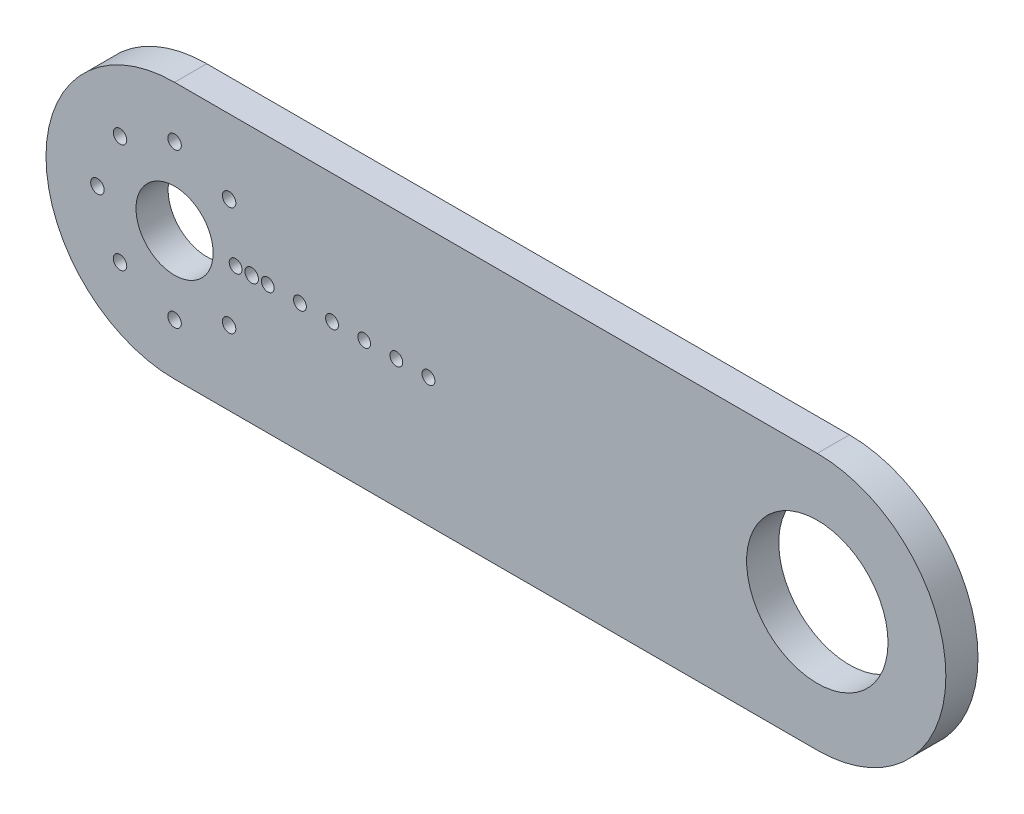
ISO-10303-21;
HEADER;
FILE_DESCRIPTION(('STEP AP214'),'2;1');
FILE_NAME('part.step','',(''),(''),'','','');
FILE_SCHEMA(('AUTOMOTIVE_DESIGN { 1 0 10303 214 1 1 1 1 }'));
ENDSEC;
DATA;
#1=APPLICATION_CONTEXT('core data for automotive mechanical design processes');
#2=APPLICATION_PROTOCOL_DEFINITION('international standard','automotive_design',2000,#1);
#3=PRODUCT_CONTEXT('',#1,'mechanical');
#4=PRODUCT('Part','Part','',(#3));
#5=PRODUCT_RELATED_PRODUCT_CATEGORY('part','',(#4));
#6=PRODUCT_DEFINITION_FORMATION('','',#4);
#7=PRODUCT_DEFINITION_CONTEXT('part definition',#1,'design');
#8=PRODUCT_DEFINITION('design','',#6,#7);
#9=PRODUCT_DEFINITION_SHAPE('','',#8);
#10=(LENGTH_UNIT() NAMED_UNIT(*) SI_UNIT(.MILLI.,.METRE.));
#11=(NAMED_UNIT(*) PLANE_ANGLE_UNIT() SI_UNIT($,.RADIAN.));
#12=(NAMED_UNIT(*) SI_UNIT($,.STERADIAN.) SOLID_ANGLE_UNIT());
#13=UNCERTAINTY_MEASURE_WITH_UNIT(LENGTH_MEASURE(1.E-05),#10,'distance_accuracy_value','');
#14=(GEOMETRIC_REPRESENTATION_CONTEXT(3) GLOBAL_UNCERTAINTY_ASSIGNED_CONTEXT((#13)) GLOBAL_UNIT_ASSIGNED_CONTEXT((#10,
#11,#12)) REPRESENTATION_CONTEXT('',''));
#15=CARTESIAN_POINT('',(0.,0.,0.));
#16=DIRECTION('',(0.,0.,1.));
#17=DIRECTION('',(1.,0.,0.));
#18=AXIS2_PLACEMENT_3D('',#15,#16,#17);
#19=CARTESIAN_POINT('',(0.,0.,2.5));
#20=DIRECTION('',(0.,0.,1.));
#21=DIRECTION('',(1.,0.,0.));
#22=AXIS2_PLACEMENT_3D('',#19,#20,#21);
#23=PLANE('',#22);
#24=CARTESIAN_POINT('',(-12.,1.25693328198353E-13,2.5));
#25=DIRECTION('',(0.,0.,1.));
#26=DIRECTION('',(1.,0.,0.));
#27=AXIS2_PLACEMENT_3D('',#24,#25,#26);
#28=CIRCLE('',#27,1.05);
#29=CARTESIAN_POINT('',(-10.95,1.25693328198353E-13,2.5));
#30=VERTEX_POINT('',#29);
#31=EDGE_CURVE('E252',#30,#30,#28,.T.);
#32=ORIENTED_EDGE('',*,*,#31,.F.);
#33=EDGE_LOOP('',(#32));
#34=FACE_BOUND('',#33,.T.);
#35=CARTESIAN_POINT('',(0.,-12.,2.5));
#36=DIRECTION('',(0.,0.,1.));
#37=DIRECTION('',(1.,0.,0.));
#38=AXIS2_PLACEMENT_3D('',#35,#36,#37);
#39=CIRCLE('',#38,1.05);
#40=CARTESIAN_POINT('',(1.04999999999992,-12.,2.5));
#41=VERTEX_POINT('',#40);
#42=EDGE_CURVE('E236',#41,#41,#39,.T.);
#43=ORIENTED_EDGE('',*,*,#42,.F.);
#44=EDGE_LOOP('',(#43));
#45=FACE_BOUND('',#44,.T.);
#46=CARTESIAN_POINT('',(12.,0.,2.5));
#47=DIRECTION('',(0.,0.,1.));
#48=DIRECTION('',(1.,0.,0.));
#49=AXIS2_PLACEMENT_3D('',#46,#47,#48);
#50=CIRCLE('',#49,1.05);
#51=CARTESIAN_POINT('',(13.05,0.,2.5));
#52=VERTEX_POINT('',#51);
#53=EDGE_CURVE('E220',#52,#52,#50,.T.);
#54=ORIENTED_EDGE('',*,*,#53,.F.);
#55=EDGE_LOOP('',(#54));
#56=FACE_BOUND('',#55,.T.);
#57=CARTESIAN_POINT('',(0.,12.,2.5));
#58=DIRECTION('',(0.,0.,1.));
#59=DIRECTION('',(1.,0.,0.));
#60=AXIS2_PLACEMENT_3D('',#57,#58,#59);
#61=CIRCLE('',#60,1.05);
#62=CARTESIAN_POINT('',(1.05,12.,2.5));
#63=VERTEX_POINT('',#62);
#64=EDGE_CURVE('E204',#63,#63,#61,.T.);
#65=ORIENTED_EDGE('',*,*,#64,.F.);
#66=EDGE_LOOP('',(#65));
#67=FACE_BOUND('',#66,.T.);
#68=CARTESIAN_POINT('',(34.5,0.,2.5));
#69=DIRECTION('',(0.,0.,1.));
#70=DIRECTION('',(1.,0.,0.));
#71=AXIS2_PLACEMENT_3D('',#68,#69,#70);
#72=CIRCLE('',#71,0.999999999999998);
#73=CARTESIAN_POINT('',(35.5,0.,2.5));
#74=VERTEX_POINT('',#73);
#75=EDGE_CURVE('E188',#74,#74,#72,.T.);
#76=ORIENTED_EDGE('',*,*,#75,.F.);
#77=EDGE_LOOP('',(#76));
#78=FACE_BOUND('',#77,.T.);
#79=CARTESIAN_POINT('',(24.5,0.,2.5));
#80=DIRECTION('',(0.,0.,1.));
#81=DIRECTION('',(1.,0.,0.));
#82=AXIS2_PLACEMENT_3D('',#79,#80,#81);
#83=CIRCLE('',#82,0.999999999999998);
#84=CARTESIAN_POINT('',(25.5,0.,2.5));
#85=VERTEX_POINT('',#84);
#86=EDGE_CURVE('E172',#85,#85,#83,.T.);
#87=ORIENTED_EDGE('',*,*,#86,.F.);
#88=EDGE_LOOP('',(#87));
#89=FACE_BOUND('',#88,.T.);
#90=CARTESIAN_POINT('',(100.,0.,2.5));
#91=DIRECTION('',(0.,0.,1.));
#92=DIRECTION('',(1.,0.,0.));
#93=AXIS2_PLACEMENT_3D('',#90,#91,#92);
#94=CIRCLE('',#93,11.);
#95=CARTESIAN_POINT('',(111.,0.,2.5));
#96=VERTEX_POINT('',#95);
#97=EDGE_CURVE('E156',#96,#96,#94,.T.);
#98=ORIENTED_EDGE('',*,*,#97,.F.);
#99=EDGE_LOOP('',(#98));
#100=FACE_BOUND('',#99,.T.);
#101=CARTESIAN_POINT('',(9.5,0.,2.5));
#102=DIRECTION('',(0.,0.,1.));
#103=DIRECTION('',(1.,0.,0.));
#104=AXIS2_PLACEMENT_3D('',#101,#102,#103);
#105=CIRCLE('',#104,1.);
#106=CARTESIAN_POINT('',(10.5,0.,2.5));
#107=VERTEX_POINT('',#106);
#108=EDGE_CURVE('E140',#107,#107,#105,.T.);
#109=ORIENTED_EDGE('',*,*,#108,.F.);
#110=EDGE_LOOP('',(#109));
#111=FACE_BOUND('',#110,.T.);
#112=CARTESIAN_POINT('',(0.,0.,2.5));
#113=DIRECTION('',(0.,0.,1.));
#114=DIRECTION('',(1.,0.,0.));
#115=AXIS2_PLACEMENT_3D('',#112,#113,#114);
#116=CIRCLE('',#115,20.);
#117=CARTESIAN_POINT('',(0.,20.,2.5));
#118=VERTEX_POINT('',#117);
#119=CARTESIAN_POINT('',(0.,-20.,2.5));
#120=VERTEX_POINT('',#119);
#121=EDGE_CURVE('E98',#118,#120,#116,.T.);
#122=ORIENTED_EDGE('',*,*,#121,.T.);
#123=DIRECTION('',(1.,0.,0.));
#124=VECTOR('',#123,1.);
#125=CARTESIAN_POINT('',(0.,-20.,2.5));
#126=LINE('',#125,#124);
#127=CARTESIAN_POINT('',(100.,-20.,2.5));
#128=VERTEX_POINT('',#127);
#129=EDGE_CURVE('E93',#120,#128,#126,.T.);
#130=ORIENTED_EDGE('',*,*,#129,.T.);
#131=CARTESIAN_POINT('',(100.,0.,2.5));
#132=DIRECTION('',(0.,0.,1.));
#133=DIRECTION('',(1.,0.,0.));
#134=AXIS2_PLACEMENT_3D('',#131,#132,#133);
#135=CIRCLE('',#134,20.);
#136=CARTESIAN_POINT('',(100.,20.,2.5));
#137=VERTEX_POINT('',#136);
#138=EDGE_CURVE('E96',#128,#137,#135,.T.);
#139=ORIENTED_EDGE('',*,*,#138,.T.);
#140=DIRECTION('',(-1.,0.,0.));
#141=VECTOR('',#140,1.);
#142=CARTESIAN_POINT('',(0.,20.,2.5));
#143=LINE('',#142,#141);
#144=EDGE_CURVE('E63',#137,#118,#143,.T.);
#145=ORIENTED_EDGE('',*,*,#144,.T.);
#146=EDGE_LOOP('',(#122,#130,#139,#145));
#147=FACE_BOUND('',#146,.T.);
#148=CARTESIAN_POINT('',(0.,0.,2.5));
#149=DIRECTION('',(0.,0.,1.));
#150=DIRECTION('',(1.,0.,0.));
#151=AXIS2_PLACEMENT_3D('',#148,#149,#150);
#152=CIRCLE('',#151,6.);
#153=CARTESIAN_POINT('',(6.,0.,2.5));
#154=VERTEX_POINT('',#153);
#155=EDGE_CURVE('E118',#154,#154,#152,.T.);
#156=ORIENTED_EDGE('',*,*,#155,.F.);
#157=EDGE_LOOP('',(#156));
#158=FACE_BOUND('',#157,.T.);
#159=CARTESIAN_POINT('',(14.5,0.,2.5));
#160=DIRECTION('',(0.,0.,1.));
#161=DIRECTION('',(1.,0.,0.));
#162=AXIS2_PLACEMENT_3D('',#159,#160,#161);
#163=CIRCLE('',#162,1.);
#164=CARTESIAN_POINT('',(15.5,0.,2.5));
#165=VERTEX_POINT('',#164);
#166=EDGE_CURVE('E148',#165,#165,#163,.T.);
#167=ORIENTED_EDGE('',*,*,#166,.F.);
#168=EDGE_LOOP('',(#167));
#169=FACE_BOUND('',#168,.T.);
#170=CARTESIAN_POINT('',(19.5,0.,2.5));
#171=DIRECTION('',(0.,0.,1.));
#172=DIRECTION('',(1.,0.,0.));
#173=AXIS2_PLACEMENT_3D('',#170,#171,#172);
#174=CIRCLE('',#173,1.);
#175=CARTESIAN_POINT('',(20.5,0.,2.5));
#176=VERTEX_POINT('',#175);
#177=EDGE_CURVE('E164',#176,#176,#174,.T.);
#178=ORIENTED_EDGE('',*,*,#177,.F.);
#179=EDGE_LOOP('',(#178));
#180=FACE_BOUND('',#179,.T.);
#181=CARTESIAN_POINT('',(29.5,0.,2.5));
#182=DIRECTION('',(0.,0.,1.));
#183=DIRECTION('',(1.,0.,0.));
#184=AXIS2_PLACEMENT_3D('',#181,#182,#183);
#185=CIRCLE('',#184,1.);
#186=CARTESIAN_POINT('',(30.5,0.,2.5));
#187=VERTEX_POINT('',#186);
#188=EDGE_CURVE('E180',#187,#187,#185,.T.);
#189=ORIENTED_EDGE('',*,*,#188,.F.);
#190=EDGE_LOOP('',(#189));
#191=FACE_BOUND('',#190,.T.);
#192=CARTESIAN_POINT('',(39.5,0.,2.5));
#193=DIRECTION('',(0.,0.,1.));
#194=DIRECTION('',(1.,0.,0.));
#195=AXIS2_PLACEMENT_3D('',#192,#193,#194);
#196=CIRCLE('',#195,0.999999999999998);
#197=CARTESIAN_POINT('',(40.5,0.,2.5));
#198=VERTEX_POINT('',#197);
#199=EDGE_CURVE('E196',#198,#198,#196,.T.);
#200=ORIENTED_EDGE('',*,*,#199,.F.);
#201=EDGE_LOOP('',(#200));
#202=FACE_BOUND('',#201,.T.);
#203=CARTESIAN_POINT('',(8.48528137423859,8.48528137423856,2.5));
#204=DIRECTION('',(0.,0.,1.));
#205=DIRECTION('',(1.,0.,0.));
#206=AXIS2_PLACEMENT_3D('',#203,#204,#205);
#207=CIRCLE('',#206,1.05);
#208=CARTESIAN_POINT('',(9.53528137423859,8.48528137423856,2.5));
#209=VERTEX_POINT('',#208);
#210=EDGE_CURVE('E212',#209,#209,#207,.T.);
#211=ORIENTED_EDGE('',*,*,#210,.F.);
#212=EDGE_LOOP('',(#211));
#213=FACE_BOUND('',#212,.T.);
#214=CARTESIAN_POINT('',(8.48528137423852,-8.48528137423862,2.5));
#215=DIRECTION('',(0.,0.,1.));
#216=DIRECTION('',(1.,0.,0.));
#217=AXIS2_PLACEMENT_3D('',#214,#215,#216);
#218=CIRCLE('',#217,1.05);
#219=CARTESIAN_POINT('',(9.53528137423852,-8.48528137423862,2.5));
#220=VERTEX_POINT('',#219);
#221=EDGE_CURVE('E228',#220,#220,#218,.T.);
#222=ORIENTED_EDGE('',*,*,#221,.F.);
#223=EDGE_LOOP('',(#222));
#224=FACE_BOUND('',#223,.T.);
#225=CARTESIAN_POINT('',(-8.48528137423865,-8.4852813742385,2.5));
#226=DIRECTION('',(0.,0.,1.));
#227=DIRECTION('',(1.,0.,0.));
#228=AXIS2_PLACEMENT_3D('',#225,#226,#227);
#229=CIRCLE('',#228,1.05);
#230=CARTESIAN_POINT('',(-7.43528137423865,-8.4852813742385,2.5));
#231=VERTEX_POINT('',#230);
#232=EDGE_CURVE('E244',#231,#231,#229,.T.);
#233=ORIENTED_EDGE('',*,*,#232,.F.);
#234=EDGE_LOOP('',(#233));
#235=FACE_BOUND('',#234,.T.);
#236=CARTESIAN_POINT('',(-8.48528137423847,8.48528137423868,2.5));
#237=DIRECTION('',(0.,0.,1.));
#238=DIRECTION('',(1.,0.,0.));
#239=AXIS2_PLACEMENT_3D('',#236,#237,#238);
#240=CIRCLE('',#239,1.05);
#241=CARTESIAN_POINT('',(-7.43528137423847,8.48528137423868,2.5));
#242=VERTEX_POINT('',#241);
#243=EDGE_CURVE('E260',#242,#242,#240,.T.);
#244=ORIENTED_EDGE('',*,*,#243,.F.);
#245=EDGE_LOOP('',(#244));
#246=FACE_BOUND('',#245,.T.);
#247=ADVANCED_FACE('F45',(#34,#45,#56,#67,#78,#89,#100,#111,#147,#158,#169,#180,#191,#202,#213,
#224,#235,#246),#23,.T.);
#248=CARTESIAN_POINT('',(0.,0.,-2.5));
#249=DIRECTION('',(0.,0.,1.));
#250=DIRECTION('',(1.,0.,0.));
#251=AXIS2_PLACEMENT_3D('',#248,#249,#250);
#252=PLANE('',#251);
#253=CARTESIAN_POINT('',(0.,0.,-2.5));
#254=DIRECTION('',(0.,0.,1.));
#255=DIRECTION('',(1.,0.,0.));
#256=AXIS2_PLACEMENT_3D('',#253,#254,#255);
#257=CIRCLE('',#256,20.);
#258=CARTESIAN_POINT('',(0.,20.,-2.5));
#259=VERTEX_POINT('',#258);
#260=CARTESIAN_POINT('',(0.,-20.,-2.5));
#261=VERTEX_POINT('',#260);
#262=EDGE_CURVE('E114',#259,#261,#257,.T.);
#263=ORIENTED_EDGE('',*,*,#262,.F.);
#264=DIRECTION('',(-1.,0.,0.));
#265=VECTOR('',#264,1.);
#266=CARTESIAN_POINT('',(0.,20.,-2.5));
#267=LINE('',#266,#265);
#268=CARTESIAN_POINT('',(100.,20.,-2.5));
#269=VERTEX_POINT('',#268);
#270=EDGE_CURVE('E86',#269,#259,#267,.T.);
#271=ORIENTED_EDGE('',*,*,#270,.F.);
#272=CARTESIAN_POINT('',(100.,0.,-2.5));
#273=DIRECTION('',(0.,0.,1.));
#274=DIRECTION('',(1.,0.,0.));
#275=AXIS2_PLACEMENT_3D('',#272,#273,#274);
#276=CIRCLE('',#275,20.);
#277=CARTESIAN_POINT('',(100.,-20.,-2.5));
#278=VERTEX_POINT('',#277);
#279=EDGE_CURVE('E80',#278,#269,#276,.T.);
#280=ORIENTED_EDGE('',*,*,#279,.F.);
#281=DIRECTION('',(1.,0.,0.));
#282=VECTOR('',#281,1.);
#283=CARTESIAN_POINT('',(0.,-20.,-2.5));
#284=LINE('',#283,#282);
#285=EDGE_CURVE('E103',#261,#278,#284,.T.);
#286=ORIENTED_EDGE('',*,*,#285,.F.);
#287=EDGE_LOOP('',(#263,#271,#280,#286));
#288=FACE_BOUND('',#287,.T.);
#289=CARTESIAN_POINT('',(0.,0.,-2.5));
#290=DIRECTION('',(0.,0.,1.));
#291=DIRECTION('',(1.,0.,0.));
#292=AXIS2_PLACEMENT_3D('',#289,#290,#291);
#293=CIRCLE('',#292,6.);
#294=CARTESIAN_POINT('',(6.,0.,-2.5));
#295=VERTEX_POINT('',#294);
#296=EDGE_CURVE('E136',#295,#295,#293,.T.);
#297=ORIENTED_EDGE('',*,*,#296,.T.);
#298=EDGE_LOOP('',(#297));
#299=FACE_BOUND('',#298,.T.);
#300=CARTESIAN_POINT('',(9.5,0.,-2.5));
#301=DIRECTION('',(0.,0.,1.));
#302=DIRECTION('',(1.,0.,0.));
#303=AXIS2_PLACEMENT_3D('',#300,#301,#302);
#304=CIRCLE('',#303,1.);
#305=CARTESIAN_POINT('',(10.5,0.,-2.5));
#306=VERTEX_POINT('',#305);
#307=EDGE_CURVE('E144',#306,#306,#304,.T.);
#308=ORIENTED_EDGE('',*,*,#307,.T.);
#309=EDGE_LOOP('',(#308));
#310=FACE_BOUND('',#309,.T.);
#311=CARTESIAN_POINT('',(14.5,0.,-2.5));
#312=DIRECTION('',(0.,0.,1.));
#313=DIRECTION('',(1.,0.,0.));
#314=AXIS2_PLACEMENT_3D('',#311,#312,#313);
#315=CIRCLE('',#314,1.);
#316=CARTESIAN_POINT('',(15.5,0.,-2.5));
#317=VERTEX_POINT('',#316);
#318=EDGE_CURVE('E152',#317,#317,#315,.T.);
#319=ORIENTED_EDGE('',*,*,#318,.T.);
#320=EDGE_LOOP('',(#319));
#321=FACE_BOUND('',#320,.T.);
#322=CARTESIAN_POINT('',(100.,0.,-2.5));
#323=DIRECTION('',(0.,0.,1.));
#324=DIRECTION('',(1.,0.,0.));
#325=AXIS2_PLACEMENT_3D('',#322,#323,#324);
#326=CIRCLE('',#325,11.);
#327=CARTESIAN_POINT('',(111.,0.,-2.5));
#328=VERTEX_POINT('',#327);
#329=EDGE_CURVE('E160',#328,#328,#326,.T.);
#330=ORIENTED_EDGE('',*,*,#329,.T.);
#331=EDGE_LOOP('',(#330));
#332=FACE_BOUND('',#331,.T.);
#333=CARTESIAN_POINT('',(19.5,0.,-2.5));
#334=DIRECTION('',(0.,0.,1.));
#335=DIRECTION('',(1.,0.,0.));
#336=AXIS2_PLACEMENT_3D('',#333,#334,#335);
#337=CIRCLE('',#336,1.);
#338=CARTESIAN_POINT('',(20.5,0.,-2.5));
#339=VERTEX_POINT('',#338);
#340=EDGE_CURVE('E168',#339,#339,#337,.T.);
#341=ORIENTED_EDGE('',*,*,#340,.T.);
#342=EDGE_LOOP('',(#341));
#343=FACE_BOUND('',#342,.T.);
#344=CARTESIAN_POINT('',(24.5,0.,-2.5));
#345=DIRECTION('',(0.,0.,1.));
#346=DIRECTION('',(1.,0.,0.));
#347=AXIS2_PLACEMENT_3D('',#344,#345,#346);
#348=CIRCLE('',#347,0.999999999999998);
#349=CARTESIAN_POINT('',(25.5,0.,-2.5));
#350=VERTEX_POINT('',#349);
#351=EDGE_CURVE('E176',#350,#350,#348,.T.);
#352=ORIENTED_EDGE('',*,*,#351,.T.);
#353=EDGE_LOOP('',(#352));
#354=FACE_BOUND('',#353,.T.);
#355=CARTESIAN_POINT('',(29.5,0.,-2.5));
#356=DIRECTION('',(0.,0.,1.));
#357=DIRECTION('',(1.,0.,0.));
#358=AXIS2_PLACEMENT_3D('',#355,#356,#357);
#359=CIRCLE('',#358,1.);
#360=CARTESIAN_POINT('',(30.5,0.,-2.5));
#361=VERTEX_POINT('',#360);
#362=EDGE_CURVE('E184',#361,#361,#359,.T.);
#363=ORIENTED_EDGE('',*,*,#362,.T.);
#364=EDGE_LOOP('',(#363));
#365=FACE_BOUND('',#364,.T.);
#366=CARTESIAN_POINT('',(34.5,0.,-2.5));
#367=DIRECTION('',(0.,0.,1.));
#368=DIRECTION('',(1.,0.,0.));
#369=AXIS2_PLACEMENT_3D('',#366,#367,#368);
#370=CIRCLE('',#369,0.999999999999998);
#371=CARTESIAN_POINT('',(35.5,0.,-2.5));
#372=VERTEX_POINT('',#371);
#373=EDGE_CURVE('E192',#372,#372,#370,.T.);
#374=ORIENTED_EDGE('',*,*,#373,.T.);
#375=EDGE_LOOP('',(#374));
#376=FACE_BOUND('',#375,.T.);
#377=CARTESIAN_POINT('',(39.5,0.,-2.5));
#378=DIRECTION('',(0.,0.,1.));
#379=DIRECTION('',(1.,0.,0.));
#380=AXIS2_PLACEMENT_3D('',#377,#378,#379);
#381=CIRCLE('',#380,0.999999999999998);
#382=CARTESIAN_POINT('',(40.5,0.,-2.5));
#383=VERTEX_POINT('',#382);
#384=EDGE_CURVE('E200',#383,#383,#381,.T.);
#385=ORIENTED_EDGE('',*,*,#384,.T.);
#386=EDGE_LOOP('',(#385));
#387=FACE_BOUND('',#386,.T.);
#388=CARTESIAN_POINT('',(0.,12.,-2.5));
#389=DIRECTION('',(0.,0.,1.));
#390=DIRECTION('',(1.,0.,0.));
#391=AXIS2_PLACEMENT_3D('',#388,#389,#390);
#392=CIRCLE('',#391,1.05);
#393=CARTESIAN_POINT('',(1.05,12.,-2.5));
#394=VERTEX_POINT('',#393);
#395=EDGE_CURVE('E208',#394,#394,#392,.T.);
#396=ORIENTED_EDGE('',*,*,#395,.T.);
#397=EDGE_LOOP('',(#396));
#398=FACE_BOUND('',#397,.T.);
#399=CARTESIAN_POINT('',(8.48528137423859,8.48528137423856,-2.5));
#400=DIRECTION('',(0.,0.,1.));
#401=DIRECTION('',(1.,0.,0.));
#402=AXIS2_PLACEMENT_3D('',#399,#400,#401);
#403=CIRCLE('',#402,1.05);
#404=CARTESIAN_POINT('',(9.53528137423859,8.48528137423856,-2.5));
#405=VERTEX_POINT('',#404);
#406=EDGE_CURVE('E216',#405,#405,#403,.T.);
#407=ORIENTED_EDGE('',*,*,#406,.T.);
#408=EDGE_LOOP('',(#407));
#409=FACE_BOUND('',#408,.T.);
#410=CARTESIAN_POINT('',(12.,0.,-2.5));
#411=DIRECTION('',(0.,0.,1.));
#412=DIRECTION('',(1.,0.,0.));
#413=AXIS2_PLACEMENT_3D('',#410,#411,#412);
#414=CIRCLE('',#413,1.05);
#415=CARTESIAN_POINT('',(13.05,0.,-2.5));
#416=VERTEX_POINT('',#415);
#417=EDGE_CURVE('E224',#416,#416,#414,.T.);
#418=ORIENTED_EDGE('',*,*,#417,.T.);
#419=EDGE_LOOP('',(#418));
#420=FACE_BOUND('',#419,.T.);
#421=CARTESIAN_POINT('',(8.48528137423852,-8.48528137423862,-2.5));
#422=DIRECTION('',(0.,0.,1.));
#423=DIRECTION('',(1.,0.,0.));
#424=AXIS2_PLACEMENT_3D('',#421,#422,#423);
#425=CIRCLE('',#424,1.05);
#426=CARTESIAN_POINT('',(9.53528137423852,-8.48528137423862,-2.5));
#427=VERTEX_POINT('',#426);
#428=EDGE_CURVE('E232',#427,#427,#425,.T.);
#429=ORIENTED_EDGE('',*,*,#428,.T.);
#430=EDGE_LOOP('',(#429));
#431=FACE_BOUND('',#430,.T.);
#432=CARTESIAN_POINT('',(0.,-12.,-2.5));
#433=DIRECTION('',(0.,0.,1.));
#434=DIRECTION('',(1.,0.,0.));
#435=AXIS2_PLACEMENT_3D('',#432,#433,#434);
#436=CIRCLE('',#435,1.05);
#437=CARTESIAN_POINT('',(1.04999999999992,-12.,-2.5));
#438=VERTEX_POINT('',#437);
#439=EDGE_CURVE('E240',#438,#438,#436,.T.);
#440=ORIENTED_EDGE('',*,*,#439,.T.);
#441=EDGE_LOOP('',(#440));
#442=FACE_BOUND('',#441,.T.);
#443=CARTESIAN_POINT('',(-8.48528137423865,-8.4852813742385,-2.5));
#444=DIRECTION('',(0.,0.,1.));
#445=DIRECTION('',(1.,0.,0.));
#446=AXIS2_PLACEMENT_3D('',#443,#444,#445);
#447=CIRCLE('',#446,1.05);
#448=CARTESIAN_POINT('',(-7.43528137423865,-8.4852813742385,-2.5));
#449=VERTEX_POINT('',#448);
#450=EDGE_CURVE('E248',#449,#449,#447,.T.);
#451=ORIENTED_EDGE('',*,*,#450,.T.);
#452=EDGE_LOOP('',(#451));
#453=FACE_BOUND('',#452,.T.);
#454=CARTESIAN_POINT('',(-12.,1.25693328198353E-13,-2.5));
#455=DIRECTION('',(0.,0.,1.));
#456=DIRECTION('',(1.,0.,0.));
#457=AXIS2_PLACEMENT_3D('',#454,#455,#456);
#458=CIRCLE('',#457,1.05);
#459=CARTESIAN_POINT('',(-10.95,1.25693328198353E-13,-2.5));
#460=VERTEX_POINT('',#459);
#461=EDGE_CURVE('E256',#460,#460,#458,.T.);
#462=ORIENTED_EDGE('',*,*,#461,.T.);
#463=EDGE_LOOP('',(#462));
#464=FACE_BOUND('',#463,.T.);
#465=CARTESIAN_POINT('',(-8.48528137423847,8.48528137423868,-2.5));
#466=DIRECTION('',(0.,0.,1.));
#467=DIRECTION('',(1.,0.,0.));
#468=AXIS2_PLACEMENT_3D('',#465,#466,#467);
#469=CIRCLE('',#468,1.05);
#470=CARTESIAN_POINT('',(-7.43528137423847,8.48528137423868,-2.5));
#471=VERTEX_POINT('',#470);
#472=EDGE_CURVE('E264',#471,#471,#469,.T.);
#473=ORIENTED_EDGE('',*,*,#472,.T.);
#474=EDGE_LOOP('',(#473));
#475=FACE_BOUND('',#474,.T.);
#476=ADVANCED_FACE('F131',(#288,#299,#310,#321,#332,#343,#354,#365,#376,#387,#398,#409,#420,
#431,#442,#453,#464,#475),#252,.F.);
#477=CARTESIAN_POINT('',(0.,0.,2.5));
#478=DIRECTION('',(0.,0.,-1.));
#479=DIRECTION('',(-1.,0.,0.));
#480=AXIS2_PLACEMENT_3D('',#477,#478,#479);
#481=CYLINDRICAL_SURFACE('',#480,20.);
#482=ORIENTED_EDGE('',*,*,#262,.T.);
#483=DIRECTION('',(0.,0.,-1.));
#484=VECTOR('',#483,1.);
#485=CARTESIAN_POINT('',(0.,-20.,2.5));
#486=LINE('',#485,#484);
#487=EDGE_CURVE('E11',#120,#261,#486,.T.);
#488=ORIENTED_EDGE('',*,*,#487,.F.);
#489=ORIENTED_EDGE('',*,*,#121,.F.);
#490=DIRECTION('',(0.,0.,-1.));
#491=VECTOR('',#490,1.);
#492=CARTESIAN_POINT('',(0.,20.,2.5));
#493=LINE('',#492,#491);
#494=EDGE_CURVE('E110',#118,#259,#493,.T.);
#495=ORIENTED_EDGE('',*,*,#494,.T.);
#496=EDGE_LOOP('',(#482,#488,#489,#495));
#497=FACE_BOUND('',#496,.T.);
#498=ADVANCED_FACE('F47',(#497),#481,.T.);
#499=CARTESIAN_POINT('',(0.,-20.,2.5));
#500=DIRECTION('',(0.,1.,0.));
#501=DIRECTION('',(-1.,0.,0.));
#502=AXIS2_PLACEMENT_3D('',#499,#500,#501);
#503=PLANE('',#502);
#504=ORIENTED_EDGE('',*,*,#285,.T.);
#505=DIRECTION('',(0.,0.,-1.));
#506=VECTOR('',#505,1.);
#507=CARTESIAN_POINT('',(100.,-20.,2.5));
#508=LINE('',#507,#506);
#509=EDGE_CURVE('E55',#128,#278,#508,.T.);
#510=ORIENTED_EDGE('',*,*,#509,.F.);
#511=ORIENTED_EDGE('',*,*,#129,.F.);
#512=ORIENTED_EDGE('',*,*,#487,.T.);
#513=EDGE_LOOP('',(#504,#510,#511,#512));
#514=FACE_BOUND('',#513,.T.);
#515=ADVANCED_FACE('F102',(#514),#503,.F.);
#516=CARTESIAN_POINT('',(100.,0.,2.5));
#517=DIRECTION('',(0.,0.,-1.));
#518=DIRECTION('',(-1.,0.,0.));
#519=AXIS2_PLACEMENT_3D('',#516,#517,#518);
#520=CYLINDRICAL_SURFACE('',#519,20.);
#521=ORIENTED_EDGE('',*,*,#279,.T.);
#522=DIRECTION('',(0.,0.,-1.));
#523=VECTOR('',#522,1.);
#524=CARTESIAN_POINT('',(100.,20.,2.5));
#525=LINE('',#524,#523);
#526=EDGE_CURVE('E105',#137,#269,#525,.T.);
#527=ORIENTED_EDGE('',*,*,#526,.F.);
#528=ORIENTED_EDGE('',*,*,#138,.F.);
#529=ORIENTED_EDGE('',*,*,#509,.T.);
#530=EDGE_LOOP('',(#521,#527,#528,#529));
#531=FACE_BOUND('',#530,.T.);
#532=ADVANCED_FACE('F106',(#531),#520,.T.);
#533=CARTESIAN_POINT('',(0.,20.,2.5));
#534=DIRECTION('',(0.,-1.,0.));
#535=DIRECTION('',(1.,0.,0.));
#536=AXIS2_PLACEMENT_3D('',#533,#534,#535);
#537=PLANE('',#536);
#538=ORIENTED_EDGE('',*,*,#270,.T.);
#539=ORIENTED_EDGE('',*,*,#494,.F.);
#540=ORIENTED_EDGE('',*,*,#144,.F.);
#541=ORIENTED_EDGE('',*,*,#526,.T.);
#542=EDGE_LOOP('',(#538,#539,#540,#541));
#543=FACE_BOUND('',#542,.T.);
#544=ADVANCED_FACE('F128',(#543),#537,.F.);
#545=CARTESIAN_POINT('',(0.,0.,2.5));
#546=DIRECTION('',(0.,0.,-1.));
#547=DIRECTION('',(-1.,0.,0.));
#548=AXIS2_PLACEMENT_3D('',#545,#546,#547);
#549=CYLINDRICAL_SURFACE('',#548,6.);
#550=ORIENTED_EDGE('',*,*,#155,.T.);
#551=EDGE_LOOP('',(#550));
#552=FACE_BOUND('',#551,.T.);
#553=ORIENTED_EDGE('',*,*,#296,.F.);
#554=EDGE_LOOP('',(#553));
#555=FACE_BOUND('',#554,.T.);
#556=ADVANCED_FACE('F285',(#552,#555),#549,.F.);
#557=CARTESIAN_POINT('',(9.5,0.,2.5));
#558=DIRECTION('',(0.,0.,-1.));
#559=DIRECTION('',(-1.,0.,0.));
#560=AXIS2_PLACEMENT_3D('',#557,#558,#559);
#561=CYLINDRICAL_SURFACE('',#560,1.);
#562=ORIENTED_EDGE('',*,*,#108,.T.);
#563=EDGE_LOOP('',(#562));
#564=FACE_BOUND('',#563,.T.);
#565=ORIENTED_EDGE('',*,*,#307,.F.);
#566=EDGE_LOOP('',(#565));
#567=FACE_BOUND('',#566,.T.);
#568=ADVANCED_FACE('F330',(#564,#567),#561,.F.);
#569=CARTESIAN_POINT('',(14.5,0.,2.5));
#570=DIRECTION('',(0.,0.,-1.));
#571=DIRECTION('',(-1.,0.,0.));
#572=AXIS2_PLACEMENT_3D('',#569,#570,#571);
#573=CYLINDRICAL_SURFACE('',#572,1.);
#574=ORIENTED_EDGE('',*,*,#166,.T.);
#575=EDGE_LOOP('',(#574));
#576=FACE_BOUND('',#575,.T.);
#577=ORIENTED_EDGE('',*,*,#318,.F.);
#578=EDGE_LOOP('',(#577));
#579=FACE_BOUND('',#578,.T.);
#580=ADVANCED_FACE('F338',(#576,#579),#573,.F.);
#581=CARTESIAN_POINT('',(100.,0.,2.5));
#582=DIRECTION('',(0.,0.,-1.));
#583=DIRECTION('',(-1.,0.,0.));
#584=AXIS2_PLACEMENT_3D('',#581,#582,#583);
#585=CYLINDRICAL_SURFACE('',#584,11.);
#586=ORIENTED_EDGE('',*,*,#97,.T.);
#587=EDGE_LOOP('',(#586));
#588=FACE_BOUND('',#587,.T.);
#589=ORIENTED_EDGE('',*,*,#329,.F.);
#590=EDGE_LOOP('',(#589));
#591=FACE_BOUND('',#590,.T.);
#592=ADVANCED_FACE('F346',(#588,#591),#585,.F.);
#593=CARTESIAN_POINT('',(19.5,0.,2.5));
#594=DIRECTION('',(0.,0.,-1.));
#595=DIRECTION('',(-1.,0.,0.));
#596=AXIS2_PLACEMENT_3D('',#593,#594,#595);
#597=CYLINDRICAL_SURFACE('',#596,1.);
#598=ORIENTED_EDGE('',*,*,#177,.T.);
#599=EDGE_LOOP('',(#598));
#600=FACE_BOUND('',#599,.T.);
#601=ORIENTED_EDGE('',*,*,#340,.F.);
#602=EDGE_LOOP('',(#601));
#603=FACE_BOUND('',#602,.T.);
#604=ADVANCED_FACE('F355',(#600,#603),#597,.F.);
#605=CARTESIAN_POINT('',(24.5,0.,2.5));
#606=DIRECTION('',(0.,0.,-1.));
#607=DIRECTION('',(-1.,0.,0.));
#608=AXIS2_PLACEMENT_3D('',#605,#606,#607);
#609=CYLINDRICAL_SURFACE('',#608,0.999999999999998);
#610=ORIENTED_EDGE('',*,*,#86,.T.);
#611=EDGE_LOOP('',(#610));
#612=FACE_BOUND('',#611,.T.);
#613=ORIENTED_EDGE('',*,*,#351,.F.);
#614=EDGE_LOOP('',(#613));
#615=FACE_BOUND('',#614,.T.);
#616=ADVANCED_FACE('F364',(#612,#615),#609,.F.);
#617=CARTESIAN_POINT('',(29.5,0.,2.5));
#618=DIRECTION('',(0.,0.,-1.));
#619=DIRECTION('',(-1.,0.,0.));
#620=AXIS2_PLACEMENT_3D('',#617,#618,#619);
#621=CYLINDRICAL_SURFACE('',#620,1.);
#622=ORIENTED_EDGE('',*,*,#188,.T.);
#623=EDGE_LOOP('',(#622));
#624=FACE_BOUND('',#623,.T.);
#625=ORIENTED_EDGE('',*,*,#362,.F.);
#626=EDGE_LOOP('',(#625));
#627=FACE_BOUND('',#626,.T.);
#628=ADVANCED_FACE('F373',(#624,#627),#621,.F.);
#629=CARTESIAN_POINT('',(34.5,0.,2.5));
#630=DIRECTION('',(0.,0.,-1.));
#631=DIRECTION('',(-1.,0.,0.));
#632=AXIS2_PLACEMENT_3D('',#629,#630,#631);
#633=CYLINDRICAL_SURFACE('',#632,0.999999999999998);
#634=ORIENTED_EDGE('',*,*,#75,.T.);
#635=EDGE_LOOP('',(#634));
#636=FACE_BOUND('',#635,.T.);
#637=ORIENTED_EDGE('',*,*,#373,.F.);
#638=EDGE_LOOP('',(#637));
#639=FACE_BOUND('',#638,.T.);
#640=ADVANCED_FACE('F382',(#636,#639),#633,.F.);
#641=CARTESIAN_POINT('',(39.5,0.,2.5));
#642=DIRECTION('',(0.,0.,-1.));
#643=DIRECTION('',(-1.,0.,0.));
#644=AXIS2_PLACEMENT_3D('',#641,#642,#643);
#645=CYLINDRICAL_SURFACE('',#644,0.999999999999998);
#646=ORIENTED_EDGE('',*,*,#199,.T.);
#647=EDGE_LOOP('',(#646));
#648=FACE_BOUND('',#647,.T.);
#649=ORIENTED_EDGE('',*,*,#384,.F.);
#650=EDGE_LOOP('',(#649));
#651=FACE_BOUND('',#650,.T.);
#652=ADVANCED_FACE('F391',(#648,#651),#645,.F.);
#653=CARTESIAN_POINT('',(0.,12.,2.5));
#654=DIRECTION('',(0.,0.,-1.));
#655=DIRECTION('',(-1.,0.,0.));
#656=AXIS2_PLACEMENT_3D('',#653,#654,#655);
#657=CYLINDRICAL_SURFACE('',#656,1.05);
#658=ORIENTED_EDGE('',*,*,#64,.T.);
#659=EDGE_LOOP('',(#658));
#660=FACE_BOUND('',#659,.T.);
#661=ORIENTED_EDGE('',*,*,#395,.F.);
#662=EDGE_LOOP('',(#661));
#663=FACE_BOUND('',#662,.T.);
#664=ADVANCED_FACE('F400',(#660,#663),#657,.F.);
#665=CARTESIAN_POINT('',(8.48528137423859,8.48528137423856,2.5));
#666=DIRECTION('',(0.,0.,-1.));
#667=DIRECTION('',(-1.,0.,0.));
#668=AXIS2_PLACEMENT_3D('',#665,#666,#667);
#669=CYLINDRICAL_SURFACE('',#668,1.05);
#670=ORIENTED_EDGE('',*,*,#210,.T.);
#671=EDGE_LOOP('',(#670));
#672=FACE_BOUND('',#671,.T.);
#673=ORIENTED_EDGE('',*,*,#406,.F.);
#674=EDGE_LOOP('',(#673));
#675=FACE_BOUND('',#674,.T.);
#676=ADVANCED_FACE('F409',(#672,#675),#669,.F.);
#677=CARTESIAN_POINT('',(12.,0.,2.5));
#678=DIRECTION('',(0.,0.,-1.));
#679=DIRECTION('',(-1.,0.,0.));
#680=AXIS2_PLACEMENT_3D('',#677,#678,#679);
#681=CYLINDRICAL_SURFACE('',#680,1.05);
#682=ORIENTED_EDGE('',*,*,#53,.T.);
#683=EDGE_LOOP('',(#682));
#684=FACE_BOUND('',#683,.T.);
#685=ORIENTED_EDGE('',*,*,#417,.F.);
#686=EDGE_LOOP('',(#685));
#687=FACE_BOUND('',#686,.T.);
#688=ADVANCED_FACE('F418',(#684,#687),#681,.F.);
#689=CARTESIAN_POINT('',(8.48528137423852,-8.48528137423862,2.5));
#690=DIRECTION('',(0.,0.,-1.));
#691=DIRECTION('',(-1.,0.,0.));
#692=AXIS2_PLACEMENT_3D('',#689,#690,#691);
#693=CYLINDRICAL_SURFACE('',#692,1.05);
#694=ORIENTED_EDGE('',*,*,#221,.T.);
#695=EDGE_LOOP('',(#694));
#696=FACE_BOUND('',#695,.T.);
#697=ORIENTED_EDGE('',*,*,#428,.F.);
#698=EDGE_LOOP('',(#697));
#699=FACE_BOUND('',#698,.T.);
#700=ADVANCED_FACE('F427',(#696,#699),#693,.F.);
#701=CARTESIAN_POINT('',(0.,-12.,2.5));
#702=DIRECTION('',(0.,0.,-1.));
#703=DIRECTION('',(-1.,0.,0.));
#704=AXIS2_PLACEMENT_3D('',#701,#702,#703);
#705=CYLINDRICAL_SURFACE('',#704,1.05);
#706=ORIENTED_EDGE('',*,*,#42,.T.);
#707=EDGE_LOOP('',(#706));
#708=FACE_BOUND('',#707,.T.);
#709=ORIENTED_EDGE('',*,*,#439,.F.);
#710=EDGE_LOOP('',(#709));
#711=FACE_BOUND('',#710,.T.);
#712=ADVANCED_FACE('F436',(#708,#711),#705,.F.);
#713=CARTESIAN_POINT('',(-8.48528137423865,-8.4852813742385,2.5));
#714=DIRECTION('',(0.,0.,-1.));
#715=DIRECTION('',(-1.,0.,0.));
#716=AXIS2_PLACEMENT_3D('',#713,#714,#715);
#717=CYLINDRICAL_SURFACE('',#716,1.05);
#718=ORIENTED_EDGE('',*,*,#232,.T.);
#719=EDGE_LOOP('',(#718));
#720=FACE_BOUND('',#719,.T.);
#721=ORIENTED_EDGE('',*,*,#450,.F.);
#722=EDGE_LOOP('',(#721));
#723=FACE_BOUND('',#722,.T.);
#724=ADVANCED_FACE('F445',(#720,#723),#717,.F.);
#725=CARTESIAN_POINT('',(-12.,1.25693328198353E-13,2.5));
#726=DIRECTION('',(0.,0.,-1.));
#727=DIRECTION('',(-1.,0.,0.));
#728=AXIS2_PLACEMENT_3D('',#725,#726,#727);
#729=CYLINDRICAL_SURFACE('',#728,1.05);
#730=ORIENTED_EDGE('',*,*,#31,.T.);
#731=EDGE_LOOP('',(#730));
#732=FACE_BOUND('',#731,.T.);
#733=ORIENTED_EDGE('',*,*,#461,.F.);
#734=EDGE_LOOP('',(#733));
#735=FACE_BOUND('',#734,.T.);
#736=ADVANCED_FACE('F454',(#732,#735),#729,.F.);
#737=CARTESIAN_POINT('',(-8.48528137423847,8.48528137423868,2.5));
#738=DIRECTION('',(0.,0.,-1.));
#739=DIRECTION('',(-1.,0.,0.));
#740=AXIS2_PLACEMENT_3D('',#737,#738,#739);
#741=CYLINDRICAL_SURFACE('',#740,1.05);
#742=ORIENTED_EDGE('',*,*,#243,.T.);
#743=EDGE_LOOP('',(#742));
#744=FACE_BOUND('',#743,.T.);
#745=ORIENTED_EDGE('',*,*,#472,.F.);
#746=EDGE_LOOP('',(#745));
#747=FACE_BOUND('',#746,.T.);
#748=ADVANCED_FACE('F272',(#744,#747),#741,.F.);
#749=CLOSED_SHELL('',(#247,#476,#498,#515,#532,#544,#556,#568,#580,#592,#604,#616,#628,#640,
#652,#664,#676,#688,#700,#712,#724,#736,#748));
#750=MANIFOLD_SOLID_BREP('B2',#749);
#751=ADVANCED_BREP_SHAPE_REPRESENTATION('',(#18,#750),#14);
#752=SHAPE_DEFINITION_REPRESENTATION(#9,#751);
ENDSEC;
END-ISO-10303-21;
